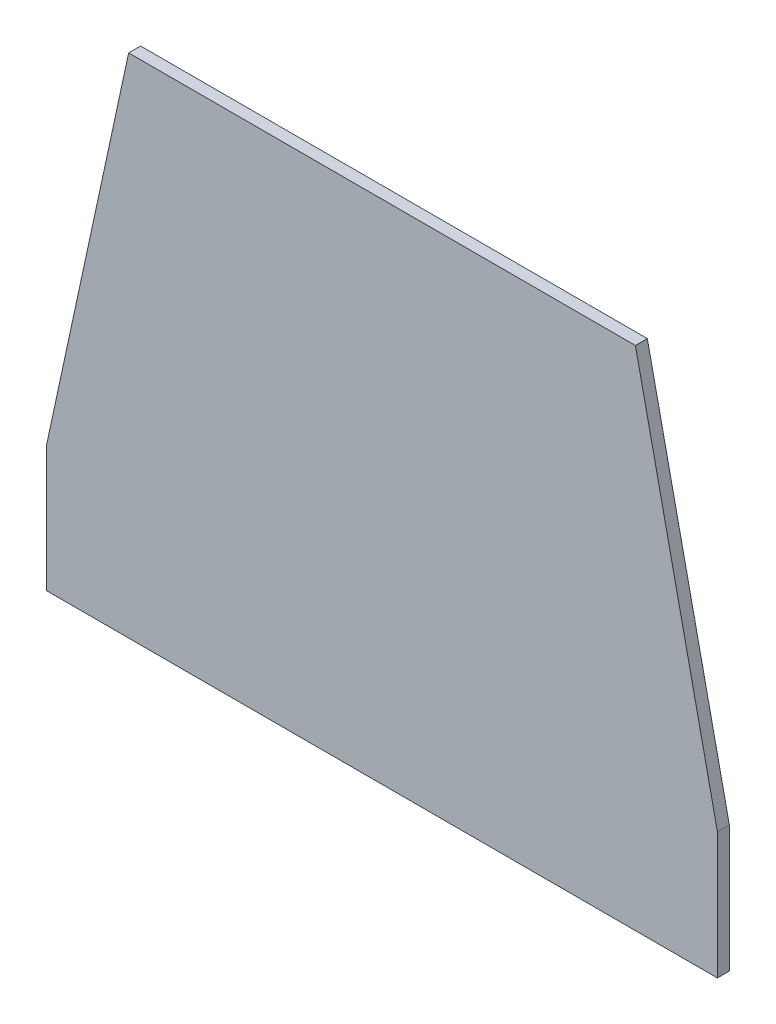
ISO-10303-21;
HEADER;
FILE_DESCRIPTION(('STEP AP214'),'2;1');
FILE_NAME('part.step','',(''),(''),'','','');
FILE_SCHEMA(('AUTOMOTIVE_DESIGN { 1 0 10303 214 1 1 1 1 }'));
ENDSEC;
DATA;
#1=APPLICATION_CONTEXT('core data for automotive mechanical design processes');
#2=APPLICATION_PROTOCOL_DEFINITION('international standard','automotive_design',2000,#1);
#3=PRODUCT_CONTEXT('',#1,'mechanical');
#4=PRODUCT('Part','Part','',(#3));
#5=PRODUCT_RELATED_PRODUCT_CATEGORY('part','',(#4));
#6=PRODUCT_DEFINITION_FORMATION('','',#4);
#7=PRODUCT_DEFINITION_CONTEXT('part definition',#1,'design');
#8=PRODUCT_DEFINITION('design','',#6,#7);
#9=PRODUCT_DEFINITION_SHAPE('','',#8);
#10=(LENGTH_UNIT() NAMED_UNIT(*) SI_UNIT(.MILLI.,.METRE.));
#11=(NAMED_UNIT(*) PLANE_ANGLE_UNIT() SI_UNIT($,.RADIAN.));
#12=(NAMED_UNIT(*) SI_UNIT($,.STERADIAN.) SOLID_ANGLE_UNIT());
#13=UNCERTAINTY_MEASURE_WITH_UNIT(LENGTH_MEASURE(1.E-05),#10,'distance_accuracy_value','');
#14=(GEOMETRIC_REPRESENTATION_CONTEXT(3) GLOBAL_UNCERTAINTY_ASSIGNED_CONTEXT((#13)) GLOBAL_UNIT_ASSIGNED_CONTEXT((#10,
#11,#12)) REPRESENTATION_CONTEXT('',''));
#15=CARTESIAN_POINT('',(0.,0.,0.));
#16=DIRECTION('',(0.,0.,1.));
#17=DIRECTION('',(1.,0.,0.));
#18=AXIS2_PLACEMENT_3D('',#15,#16,#17);
#19=CARTESIAN_POINT('',(0.,0.,16.));
#20=DIRECTION('',(1.,0.,0.));
#21=DIRECTION('',(0.,0.,-1.));
#22=AXIS2_PLACEMENT_3D('',#19,#20,#21);
#23=PLANE('',#22);
#24=DIRECTION('',(0.,-1.,0.));
#25=VECTOR('',#24,1.);
#26=CARTESIAN_POINT('',(0.,0.,0.));
#27=LINE('',#26,#25);
#28=CARTESIAN_POINT('',(0.,170.,0.));
#29=VERTEX_POINT('',#28);
#30=CARTESIAN_POINT('',(0.,0.,0.));
#31=VERTEX_POINT('',#30);
#32=EDGE_CURVE('E114',#29,#31,#27,.T.);
#33=ORIENTED_EDGE('',*,*,#32,.T.);
#34=DIRECTION('',(0.,0.,-1.));
#35=VECTOR('',#34,1.);
#36=CARTESIAN_POINT('',(0.,0.,16.));
#37=LINE('',#36,#35);
#38=CARTESIAN_POINT('',(0.,0.,16.));
#39=VERTEX_POINT('',#38);
#40=EDGE_CURVE('E11',#39,#31,#37,.T.);
#41=ORIENTED_EDGE('',*,*,#40,.F.);
#42=DIRECTION('',(0.,-1.,0.));
#43=VECTOR('',#42,1.);
#44=CARTESIAN_POINT('',(0.,0.,16.));
#45=LINE('',#44,#43);
#46=CARTESIAN_POINT('',(0.,170.,16.));
#47=VERTEX_POINT('',#46);
#48=EDGE_CURVE('E124',#47,#39,#45,.T.);
#49=ORIENTED_EDGE('',*,*,#48,.F.);
#50=DIRECTION('',(0.,0.,-1.));
#51=VECTOR('',#50,1.);
#52=CARTESIAN_POINT('',(0.,170.,16.));
#53=LINE('',#52,#51);
#54=EDGE_CURVE('E110',#47,#29,#53,.T.);
#55=ORIENTED_EDGE('',*,*,#54,.T.);
#56=EDGE_LOOP('',(#33,#41,#49,#55));
#57=FACE_BOUND('',#56,.T.);
#58=ADVANCED_FACE('F30',(#57),#23,.F.);
#59=CARTESIAN_POINT('',(0.,0.,16.));
#60=DIRECTION('',(0.,1.,0.));
#61=DIRECTION('',(0.,0.,1.));
#62=AXIS2_PLACEMENT_3D('',#59,#60,#61);
#63=PLANE('',#62);
#64=DIRECTION('',(1.,0.,0.));
#65=VECTOR('',#64,1.);
#66=CARTESIAN_POINT('',(0.,0.,0.));
#67=LINE('',#66,#65);
#68=CARTESIAN_POINT('',(900.,0.,0.));
#69=VERTEX_POINT('',#68);
#70=EDGE_CURVE('E117',#31,#69,#67,.T.);
#71=ORIENTED_EDGE('',*,*,#70,.T.);
#72=DIRECTION('',(0.,0.,-1.));
#73=VECTOR('',#72,1.);
#74=CARTESIAN_POINT('',(900.,0.,16.));
#75=LINE('',#74,#73);
#76=CARTESIAN_POINT('',(900.,0.,16.));
#77=VERTEX_POINT('',#76);
#78=EDGE_CURVE('E38',#77,#69,#75,.T.);
#79=ORIENTED_EDGE('',*,*,#78,.F.);
#80=DIRECTION('',(1.,0.,0.));
#81=VECTOR('',#80,1.);
#82=CARTESIAN_POINT('',(0.,0.,16.));
#83=LINE('',#82,#81);
#84=EDGE_CURVE('E83',#39,#77,#83,.T.);
#85=ORIENTED_EDGE('',*,*,#84,.F.);
#86=ORIENTED_EDGE('',*,*,#40,.T.);
#87=EDGE_LOOP('',(#71,#79,#85,#86));
#88=FACE_BOUND('',#87,.T.);
#89=ADVANCED_FACE('F148',(#88),#63,.F.);
#90=CARTESIAN_POINT('',(900.,0.,16.));
#91=DIRECTION('',(-1.,0.,0.));
#92=DIRECTION('',(0.,-1.,0.));
#93=AXIS2_PLACEMENT_3D('',#90,#91,#92);
#94=PLANE('',#93);
#95=DIRECTION('',(0.,1.,0.));
#96=VECTOR('',#95,1.);
#97=CARTESIAN_POINT('',(900.,0.,0.));
#98=LINE('',#97,#96);
#99=CARTESIAN_POINT('',(900.,170.,0.));
#100=VERTEX_POINT('',#99);
#101=EDGE_CURVE('E119',#69,#100,#98,.T.);
#102=ORIENTED_EDGE('',*,*,#101,.T.);
#103=DIRECTION('',(0.,0.,-1.));
#104=VECTOR('',#103,1.);
#105=CARTESIAN_POINT('',(900.,170.,16.));
#106=LINE('',#105,#104);
#107=CARTESIAN_POINT('',(900.,170.,16.));
#108=VERTEX_POINT('',#107);
#109=EDGE_CURVE('E105',#108,#100,#106,.T.);
#110=ORIENTED_EDGE('',*,*,#109,.F.);
#111=DIRECTION('',(0.,1.,0.));
#112=VECTOR('',#111,1.);
#113=CARTESIAN_POINT('',(900.,0.,16.));
#114=LINE('',#113,#112);
#115=EDGE_CURVE('E96',#77,#108,#114,.T.);
#116=ORIENTED_EDGE('',*,*,#115,.F.);
#117=ORIENTED_EDGE('',*,*,#78,.T.);
#118=EDGE_LOOP('',(#102,#110,#116,#117));
#119=FACE_BOUND('',#118,.T.);
#120=ADVANCED_FACE('F130',(#119),#94,.F.);
#121=CARTESIAN_POINT('',(790.,680.,16.));
#122=DIRECTION('',(-0.977521044082329,-0.210837872253052,0.));
#123=DIRECTION('',(0.210837872253052,-0.977521044082329,0.));
#124=AXIS2_PLACEMENT_3D('',#121,#122,#123);
#125=PLANE('',#124);
#126=DIRECTION('',(-0.210837872253052,0.977521044082329,0.));
#127=VECTOR('',#126,1.);
#128=CARTESIAN_POINT('',(790.,680.,0.));
#129=LINE('',#128,#127);
#130=CARTESIAN_POINT('',(790.,680.,0.));
#131=VERTEX_POINT('',#130);
#132=EDGE_CURVE('E104',#100,#131,#129,.T.);
#133=ORIENTED_EDGE('',*,*,#132,.T.);
#134=DIRECTION('',(0.,0.,-1.));
#135=VECTOR('',#134,1.);
#136=CARTESIAN_POINT('',(790.,680.,16.));
#137=LINE('',#136,#135);
#138=CARTESIAN_POINT('',(790.,680.,16.));
#139=VERTEX_POINT('',#138);
#140=EDGE_CURVE('E101',#139,#131,#137,.T.);
#141=ORIENTED_EDGE('',*,*,#140,.F.);
#142=DIRECTION('',(-0.210837872253052,0.977521044082329,0.));
#143=VECTOR('',#142,1.);
#144=CARTESIAN_POINT('',(790.,680.,16.));
#145=LINE('',#144,#143);
#146=EDGE_CURVE('E90',#108,#139,#145,.T.);
#147=ORIENTED_EDGE('',*,*,#146,.F.);
#148=ORIENTED_EDGE('',*,*,#109,.T.);
#149=EDGE_LOOP('',(#133,#141,#147,#148));
#150=FACE_BOUND('',#149,.T.);
#151=ADVANCED_FACE('F102',(#150),#125,.F.);
#152=CARTESIAN_POINT('',(110.,680.,16.));
#153=DIRECTION('',(0.,-1.,0.));
#154=DIRECTION('',(1.,0.,0.));
#155=AXIS2_PLACEMENT_3D('',#152,#153,#154);
#156=PLANE('',#155);
#157=DIRECTION('',(-1.,0.,0.));
#158=VECTOR('',#157,1.);
#159=CARTESIAN_POINT('',(110.,680.,0.));
#160=LINE('',#159,#158);
#161=CARTESIAN_POINT('',(110.,680.,0.));
#162=VERTEX_POINT('',#161);
#163=EDGE_CURVE('E69',#131,#162,#160,.T.);
#164=ORIENTED_EDGE('',*,*,#163,.T.);
#165=DIRECTION('',(0.,0.,-1.));
#166=VECTOR('',#165,1.);
#167=CARTESIAN_POINT('',(110.,680.,16.));
#168=LINE('',#167,#166);
#169=CARTESIAN_POINT('',(110.,680.,16.));
#170=VERTEX_POINT('',#169);
#171=EDGE_CURVE('E106',#170,#162,#168,.T.);
#172=ORIENTED_EDGE('',*,*,#171,.F.);
#173=DIRECTION('',(-1.,0.,0.));
#174=VECTOR('',#173,1.);
#175=CARTESIAN_POINT('',(110.,680.,16.));
#176=LINE('',#175,#174);
#177=EDGE_CURVE('E94',#139,#170,#176,.T.);
#178=ORIENTED_EDGE('',*,*,#177,.F.);
#179=ORIENTED_EDGE('',*,*,#140,.T.);
#180=EDGE_LOOP('',(#164,#172,#178,#179));
#181=FACE_BOUND('',#180,.T.);
#182=ADVANCED_FACE('F108',(#181),#156,.F.);
#183=CARTESIAN_POINT('',(110.,680.,16.));
#184=DIRECTION('',(0.977521044082329,-0.210837872253051,0.));
#185=DIRECTION('',(0.210837872253051,0.977521044082329,0.));
#186=AXIS2_PLACEMENT_3D('',#183,#184,#185);
#187=PLANE('',#186);
#188=DIRECTION('',(-0.210837872253051,-0.977521044082329,0.));
#189=VECTOR('',#188,1.);
#190=CARTESIAN_POINT('',(110.,680.,0.));
#191=LINE('',#190,#189);
#192=EDGE_CURVE('E75',#162,#29,#191,.T.);
#193=ORIENTED_EDGE('',*,*,#192,.T.);
#194=ORIENTED_EDGE('',*,*,#54,.F.);
#195=DIRECTION('',(-0.210837872253051,-0.977521044082329,0.));
#196=VECTOR('',#195,1.);
#197=CARTESIAN_POINT('',(110.,680.,16.));
#198=LINE('',#197,#196);
#199=EDGE_CURVE('E46',#170,#47,#198,.T.);
#200=ORIENTED_EDGE('',*,*,#199,.F.);
#201=ORIENTED_EDGE('',*,*,#171,.T.);
#202=EDGE_LOOP('',(#193,#194,#200,#201));
#203=FACE_BOUND('',#202,.T.);
#204=ADVANCED_FACE('F137',(#203),#187,.F.);
#205=CARTESIAN_POINT('',(0.,0.,16.));
#206=DIRECTION('',(0.,0.,-1.));
#207=DIRECTION('',(-1.,0.,0.));
#208=AXIS2_PLACEMENT_3D('',#205,#206,#207);
#209=PLANE('',#208);
#210=ORIENTED_EDGE('',*,*,#48,.T.);
#211=ORIENTED_EDGE('',*,*,#84,.T.);
#212=ORIENTED_EDGE('',*,*,#115,.T.);
#213=ORIENTED_EDGE('',*,*,#146,.T.);
#214=ORIENTED_EDGE('',*,*,#177,.T.);
#215=ORIENTED_EDGE('',*,*,#199,.T.);
#216=EDGE_LOOP('',(#210,#211,#212,#213,#214,#215));
#217=FACE_BOUND('',#216,.T.);
#218=ADVANCED_FACE('F92',(#217),#209,.F.);
#219=CARTESIAN_POINT('',(0.,0.,0.));
#220=DIRECTION('',(0.,0.,-1.));
#221=DIRECTION('',(-1.,0.,0.));
#222=AXIS2_PLACEMENT_3D('',#219,#220,#221);
#223=PLANE('',#222);
#224=ORIENTED_EDGE('',*,*,#32,.F.);
#225=ORIENTED_EDGE('',*,*,#192,.F.);
#226=ORIENTED_EDGE('',*,*,#163,.F.);
#227=ORIENTED_EDGE('',*,*,#132,.F.);
#228=ORIENTED_EDGE('',*,*,#101,.F.);
#229=ORIENTED_EDGE('',*,*,#70,.F.);
#230=EDGE_LOOP('',(#224,#225,#226,#227,#228,#229));
#231=FACE_BOUND('',#230,.T.);
#232=ADVANCED_FACE('F133',(#231),#223,.T.);
#233=CLOSED_SHELL('',(#58,#89,#120,#151,#182,#204,#218,#232));
#234=MANIFOLD_SOLID_BREP('B2',#233);
#235=ADVANCED_BREP_SHAPE_REPRESENTATION('',(#18,#234),#14);
#236=SHAPE_DEFINITION_REPRESENTATION(#9,#235);
ENDSEC;
END-ISO-10303-21;
